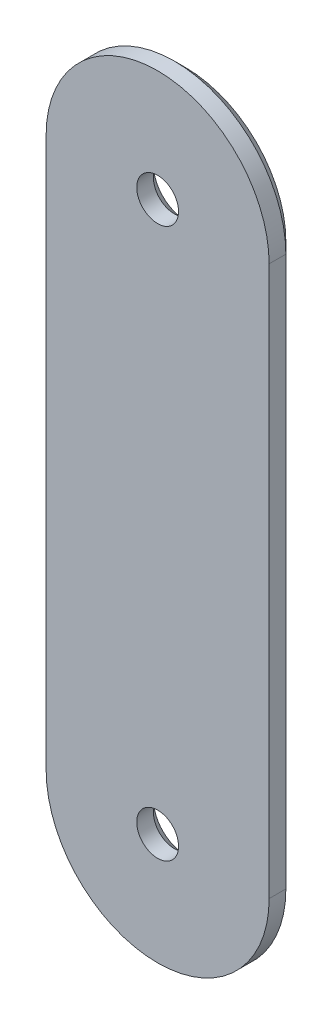
ISO-10303-21;
HEADER;
FILE_DESCRIPTION(('STEP AP214'),'2;1');
FILE_NAME('part.step','',(''),(''),'','','');
FILE_SCHEMA(('AUTOMOTIVE_DESIGN { 1 0 10303 214 1 1 1 1 }'));
ENDSEC;
DATA;
#1=APPLICATION_CONTEXT('core data for automotive mechanical design processes');
#2=APPLICATION_PROTOCOL_DEFINITION('international standard','automotive_design',2000,#1);
#3=PRODUCT_CONTEXT('',#1,'mechanical');
#4=PRODUCT('Part','Part','',(#3));
#5=PRODUCT_RELATED_PRODUCT_CATEGORY('part','',(#4));
#6=PRODUCT_DEFINITION_FORMATION('','',#4);
#7=PRODUCT_DEFINITION_CONTEXT('part definition',#1,'design');
#8=PRODUCT_DEFINITION('design','',#6,#7);
#9=PRODUCT_DEFINITION_SHAPE('','',#8);
#10=(LENGTH_UNIT() NAMED_UNIT(*) SI_UNIT(.MILLI.,.METRE.));
#11=(NAMED_UNIT(*) PLANE_ANGLE_UNIT() SI_UNIT($,.RADIAN.));
#12=(NAMED_UNIT(*) SI_UNIT($,.STERADIAN.) SOLID_ANGLE_UNIT());
#13=UNCERTAINTY_MEASURE_WITH_UNIT(LENGTH_MEASURE(1.E-05),#10,'distance_accuracy_value','');
#14=(GEOMETRIC_REPRESENTATION_CONTEXT(3) GLOBAL_UNCERTAINTY_ASSIGNED_CONTEXT((#13)) GLOBAL_UNIT_ASSIGNED_CONTEXT((#10,
#11,#12)) REPRESENTATION_CONTEXT('',''));
#15=CARTESIAN_POINT('',(0.,0.,0.));
#16=DIRECTION('',(0.,0.,1.));
#17=DIRECTION('',(1.,0.,0.));
#18=AXIS2_PLACEMENT_3D('',#15,#16,#17);
#19=CARTESIAN_POINT('',(-25.4,0.,6.35));
#20=DIRECTION('',(1.,0.,0.));
#21=DIRECTION('',(0.,1.,0.));
#22=AXIS2_PLACEMENT_3D('',#19,#20,#21);
#23=PLANE('',#22);
#24=DIRECTION('',(0.,0.,-1.));
#25=VECTOR('',#24,1.);
#26=CARTESIAN_POINT('',(-25.4,0.,6.35));
#27=LINE('',#26,#25);
#28=CARTESIAN_POINT('',(-25.4,0.,6.35));
#29=VERTEX_POINT('',#28);
#30=CARTESIAN_POINT('',(-25.4,0.,2.54000000000001));
#31=VERTEX_POINT('',#30);
#32=EDGE_CURVE('E201',#29,#31,#27,.T.);
#33=ORIENTED_EDGE('',*,*,#32,.T.);
#34=DIRECTION('',(0.,-1.,0.));
#35=VECTOR('',#34,1.);
#36=CARTESIAN_POINT('',(-25.4,0.,2.54000000000001));
#37=LINE('',#36,#35);
#38=CARTESIAN_POINT('',(-25.4,-125.222,2.54000000000001));
#39=VERTEX_POINT('',#38);
#40=EDGE_CURVE('E130',#31,#39,#37,.T.);
#41=ORIENTED_EDGE('',*,*,#40,.T.);
#42=DIRECTION('',(0.,0.,-1.));
#43=VECTOR('',#42,1.);
#44=CARTESIAN_POINT('',(-25.4,-125.222,6.35));
#45=LINE('',#44,#43);
#46=CARTESIAN_POINT('',(-25.4,-125.222,6.35));
#47=VERTEX_POINT('',#46);
#48=EDGE_CURVE('E111',#47,#39,#45,.T.);
#49=ORIENTED_EDGE('',*,*,#48,.F.);
#50=DIRECTION('',(0.,-1.,0.));
#51=VECTOR('',#50,1.);
#52=CARTESIAN_POINT('',(-25.4,0.,6.35));
#53=LINE('',#52,#51);
#54=EDGE_CURVE('E119',#29,#47,#53,.T.);
#55=ORIENTED_EDGE('',*,*,#54,.F.);
#56=EDGE_LOOP('',(#33,#41,#49,#55));
#57=FACE_BOUND('',#56,.T.);
#58=ADVANCED_FACE('F47',(#57),#23,.F.);
#59=CARTESIAN_POINT('',(0.,-125.222,6.35));
#60=DIRECTION('',(0.,0.,-1.));
#61=DIRECTION('',(-1.,0.,0.));
#62=AXIS2_PLACEMENT_3D('',#59,#60,#61);
#63=CYLINDRICAL_SURFACE('',#62,25.4);
#64=ORIENTED_EDGE('',*,*,#48,.T.);
#65=CARTESIAN_POINT('',(0.,-125.222,2.54000000000001));
#66=DIRECTION('',(0.,0.,1.));
#67=DIRECTION('',(1.,0.,0.));
#68=AXIS2_PLACEMENT_3D('',#65,#66,#67);
#69=CIRCLE('',#68,25.4);
#70=CARTESIAN_POINT('',(25.4,-125.222,2.54000000000001));
#71=VERTEX_POINT('',#70);
#72=EDGE_CURVE('E132',#39,#71,#69,.T.);
#73=ORIENTED_EDGE('',*,*,#72,.T.);
#74=DIRECTION('',(0.,0.,-1.));
#75=VECTOR('',#74,1.);
#76=CARTESIAN_POINT('',(25.4,-125.222,6.35));
#77=LINE('',#76,#75);
#78=CARTESIAN_POINT('',(25.4,-125.222,6.35));
#79=VERTEX_POINT('',#78);
#80=EDGE_CURVE('E113',#79,#71,#77,.T.);
#81=ORIENTED_EDGE('',*,*,#80,.F.);
#82=CARTESIAN_POINT('',(0.,-125.222,6.35));
#83=DIRECTION('',(0.,0.,1.));
#84=DIRECTION('',(1.,0.,0.));
#85=AXIS2_PLACEMENT_3D('',#82,#83,#84);
#86=CIRCLE('',#85,25.4);
#87=EDGE_CURVE('E106',#47,#79,#86,.T.);
#88=ORIENTED_EDGE('',*,*,#87,.F.);
#89=EDGE_LOOP('',(#64,#73,#81,#88));
#90=FACE_BOUND('',#89,.T.);
#91=ADVANCED_FACE('F108',(#90),#63,.T.);
#92=CARTESIAN_POINT('',(25.4,0.,6.35));
#93=DIRECTION('',(1.,0.,0.));
#94=DIRECTION('',(0.,1.,0.));
#95=AXIS2_PLACEMENT_3D('',#92,#93,#94);
#96=PLANE('',#95);
#97=ORIENTED_EDGE('',*,*,#80,.T.);
#98=DIRECTION('',(0.,1.,0.));
#99=VECTOR('',#98,1.);
#100=CARTESIAN_POINT('',(25.4,0.,2.54000000000001));
#101=LINE('',#100,#99);
#102=CARTESIAN_POINT('',(25.4,0.,2.54000000000001));
#103=VERTEX_POINT('',#102);
#104=EDGE_CURVE('E74',#71,#103,#101,.T.);
#105=ORIENTED_EDGE('',*,*,#104,.T.);
#106=DIRECTION('',(0.,0.,-1.));
#107=VECTOR('',#106,1.);
#108=CARTESIAN_POINT('',(25.4,0.,6.35));
#109=LINE('',#108,#107);
#110=CARTESIAN_POINT('',(25.4,0.,6.35));
#111=VERTEX_POINT('',#110);
#112=EDGE_CURVE('E138',#111,#103,#109,.T.);
#113=ORIENTED_EDGE('',*,*,#112,.F.);
#114=DIRECTION('',(0.,-1.,0.));
#115=VECTOR('',#114,1.);
#116=CARTESIAN_POINT('',(25.4,0.,6.35));
#117=LINE('',#116,#115);
#118=EDGE_CURVE('E118',#111,#79,#117,.T.);
#119=ORIENTED_EDGE('',*,*,#118,.T.);
#120=EDGE_LOOP('',(#97,#105,#113,#119));
#121=FACE_BOUND('',#120,.T.);
#122=ADVANCED_FACE('F214',(#121),#96,.T.);
#123=CARTESIAN_POINT('',(0.,0.,6.35));
#124=DIRECTION('',(0.,0.,-1.));
#125=DIRECTION('',(-1.,0.,0.));
#126=AXIS2_PLACEMENT_3D('',#123,#124,#125);
#127=CYLINDRICAL_SURFACE('',#126,25.4);
#128=ORIENTED_EDGE('',*,*,#112,.T.);
#129=CARTESIAN_POINT('',(0.,0.,2.54000000000001));
#130=DIRECTION('',(0.,0.,1.));
#131=DIRECTION('',(1.,0.,0.));
#132=AXIS2_PLACEMENT_3D('',#129,#130,#131);
#133=CIRCLE('',#132,25.4);
#134=EDGE_CURVE('E66',#103,#31,#133,.T.);
#135=ORIENTED_EDGE('',*,*,#134,.T.);
#136=ORIENTED_EDGE('',*,*,#32,.F.);
#137=CARTESIAN_POINT('',(0.,0.,6.35));
#138=DIRECTION('',(0.,0.,1.));
#139=DIRECTION('',(1.,0.,0.));
#140=AXIS2_PLACEMENT_3D('',#137,#138,#139);
#141=CIRCLE('',#140,25.4);
#142=EDGE_CURVE('E124',#111,#29,#141,.T.);
#143=ORIENTED_EDGE('',*,*,#142,.F.);
#144=EDGE_LOOP('',(#128,#135,#136,#143));
#145=FACE_BOUND('',#144,.T.);
#146=ADVANCED_FACE('F204',(#145),#127,.T.);
#147=CARTESIAN_POINT('',(0.,-125.222,6.35));
#148=DIRECTION('',(0.,0.,1.));
#149=DIRECTION('',(1.,0.,0.));
#150=AXIS2_PLACEMENT_3D('',#147,#148,#149);
#151=PLANE('',#150);
#152=CARTESIAN_POINT('',(0.,0.,6.35));
#153=DIRECTION('',(0.,0.,1.));
#154=DIRECTION('',(1.,0.,0.));
#155=AXIS2_PLACEMENT_3D('',#152,#153,#154);
#156=CIRCLE('',#155,4.7625);
#157=CARTESIAN_POINT('',(4.7625,0.,6.35));
#158=VERTEX_POINT('',#157);
#159=EDGE_CURVE('E127',#158,#158,#156,.T.);
#160=ORIENTED_EDGE('',*,*,#159,.F.);
#161=EDGE_LOOP('',(#160));
#162=FACE_BOUND('',#161,.T.);
#163=CARTESIAN_POINT('',(0.,-125.222,6.35));
#164=DIRECTION('',(0.,0.,1.));
#165=DIRECTION('',(1.,0.,0.));
#166=AXIS2_PLACEMENT_3D('',#163,#164,#165);
#167=CIRCLE('',#166,4.7625);
#168=CARTESIAN_POINT('',(4.7625,-125.222,6.35));
#169=VERTEX_POINT('',#168);
#170=EDGE_CURVE('E184',#169,#169,#167,.T.);
#171=ORIENTED_EDGE('',*,*,#170,.F.);
#172=EDGE_LOOP('',(#171));
#173=FACE_BOUND('',#172,.T.);
#174=ORIENTED_EDGE('',*,*,#54,.T.);
#175=ORIENTED_EDGE('',*,*,#87,.T.);
#176=ORIENTED_EDGE('',*,*,#118,.F.);
#177=ORIENTED_EDGE('',*,*,#142,.T.);
#178=EDGE_LOOP('',(#174,#175,#176,#177));
#179=FACE_BOUND('',#178,.T.);
#180=ADVANCED_FACE('F122',(#162,#173,#179),#151,.T.);
#181=CARTESIAN_POINT('',(0.,-125.222,0.));
#182=DIRECTION('',(0.,0.,1.));
#183=DIRECTION('',(1.,0.,0.));
#184=AXIS2_PLACEMENT_3D('',#181,#182,#183);
#185=PLANE('',#184);
#186=DIRECTION('',(0.,-1.,0.));
#187=VECTOR('',#186,1.);
#188=CARTESIAN_POINT('',(22.86,-125.222,0.));
#189=LINE('',#188,#187);
#190=CARTESIAN_POINT('',(22.86,0.,0.));
#191=VERTEX_POINT('',#190);
#192=CARTESIAN_POINT('',(22.86,-125.222,0.));
#193=VERTEX_POINT('',#192);
#194=EDGE_CURVE('E155',#191,#193,#189,.T.);
#195=ORIENTED_EDGE('',*,*,#194,.T.);
#196=CARTESIAN_POINT('',(0.,-125.222,0.));
#197=DIRECTION('',(0.,0.,1.));
#198=DIRECTION('',(1.,0.,0.));
#199=AXIS2_PLACEMENT_3D('',#196,#197,#198);
#200=CIRCLE('',#199,22.86);
#201=CARTESIAN_POINT('',(-22.86,-125.222,0.));
#202=VERTEX_POINT('',#201);
#203=EDGE_CURVE('E158',#193,#202,#200,.F.);
#204=ORIENTED_EDGE('',*,*,#203,.T.);
#205=DIRECTION('',(0.,1.,0.));
#206=VECTOR('',#205,1.);
#207=CARTESIAN_POINT('',(-22.86,-125.222,0.));
#208=LINE('',#207,#206);
#209=CARTESIAN_POINT('',(-22.86,0.,0.));
#210=VERTEX_POINT('',#209);
#211=EDGE_CURVE('E149',#202,#210,#208,.T.);
#212=ORIENTED_EDGE('',*,*,#211,.T.);
#213=CARTESIAN_POINT('',(0.,0.,0.));
#214=DIRECTION('',(0.,0.,1.));
#215=DIRECTION('',(1.,0.,0.));
#216=AXIS2_PLACEMENT_3D('',#213,#214,#215);
#217=CIRCLE('',#216,22.86);
#218=EDGE_CURVE('E152',#210,#191,#217,.F.);
#219=ORIENTED_EDGE('',*,*,#218,.T.);
#220=EDGE_LOOP('',(#195,#204,#212,#219));
#221=FACE_BOUND('',#220,.T.);
#222=CARTESIAN_POINT('',(0.,-125.222,0.));
#223=DIRECTION('',(0.,0.,1.));
#224=DIRECTION('',(1.,0.,0.));
#225=AXIS2_PLACEMENT_3D('',#222,#223,#224);
#226=CIRCLE('',#225,7.30249999999999);
#227=CARTESIAN_POINT('',(7.30249999999999,-125.222,0.));
#228=VERTEX_POINT('',#227);
#229=EDGE_CURVE('E145',#228,#228,#226,.T.);
#230=ORIENTED_EDGE('',*,*,#229,.T.);
#231=EDGE_LOOP('',(#230));
#232=FACE_BOUND('',#231,.T.);
#233=CARTESIAN_POINT('',(0.,0.,0.));
#234=DIRECTION('',(0.,0.,1.));
#235=DIRECTION('',(1.,0.,0.));
#236=AXIS2_PLACEMENT_3D('',#233,#234,#235);
#237=CIRCLE('',#236,7.30249999999995);
#238=CARTESIAN_POINT('',(7.30249999999995,0.,0.));
#239=VERTEX_POINT('',#238);
#240=EDGE_CURVE('E136',#239,#239,#237,.T.);
#241=ORIENTED_EDGE('',*,*,#240,.T.);
#242=EDGE_LOOP('',(#241));
#243=FACE_BOUND('',#242,.T.);
#244=ADVANCED_FACE('F264',(#221,#232,#243),#185,.F.);
#245=CARTESIAN_POINT('',(0.,-125.222,0.));
#246=DIRECTION('',(0.,0.,1.));
#247=DIRECTION('',(1.,0.,0.));
#248=AXIS2_PLACEMENT_3D('',#245,#246,#247);
#249=CYLINDRICAL_SURFACE('',#248,4.7625);
#250=CARTESIAN_POINT('',(0.,-125.222,2.54000000000002));
#251=DIRECTION('',(0.,0.,1.));
#252=DIRECTION('',(1.,0.,0.));
#253=AXIS2_PLACEMENT_3D('',#250,#251,#252);
#254=CIRCLE('',#253,4.7625);
#255=CARTESIAN_POINT('',(4.7625,-125.222,2.54000000000002));
#256=VERTEX_POINT('',#255);
#257=EDGE_CURVE('E58',#256,#256,#254,.F.);
#258=ORIENTED_EDGE('',*,*,#257,.T.);
#259=EDGE_LOOP('',(#258));
#260=FACE_BOUND('',#259,.T.);
#261=ORIENTED_EDGE('',*,*,#170,.T.);
#262=EDGE_LOOP('',(#261));
#263=FACE_BOUND('',#262,.T.);
#264=ADVANCED_FACE('F267',(#260,#263),#249,.F.);
#265=CARTESIAN_POINT('',(0.,0.,0.));
#266=DIRECTION('',(0.,0.,1.));
#267=DIRECTION('',(1.,0.,0.));
#268=AXIS2_PLACEMENT_3D('',#265,#266,#267);
#269=CYLINDRICAL_SURFACE('',#268,4.7625);
#270=CARTESIAN_POINT('',(0.,0.,2.53999999999997));
#271=DIRECTION('',(0.,0.,1.));
#272=DIRECTION('',(1.,0.,0.));
#273=AXIS2_PLACEMENT_3D('',#270,#271,#272);
#274=CIRCLE('',#273,4.7625);
#275=CARTESIAN_POINT('',(4.7625,0.,2.53999999999997));
#276=VERTEX_POINT('',#275);
#277=EDGE_CURVE('E11',#276,#276,#274,.F.);
#278=ORIENTED_EDGE('',*,*,#277,.T.);
#279=EDGE_LOOP('',(#278));
#280=FACE_BOUND('',#279,.T.);
#281=ORIENTED_EDGE('',*,*,#159,.T.);
#282=EDGE_LOOP('',(#281));
#283=FACE_BOUND('',#282,.T.);
#284=ADVANCED_FACE('F251',(#280,#283),#269,.F.);
#285=CARTESIAN_POINT('',(0.,0.,2.54000000000001));
#286=DIRECTION('',(0.,0.,1.));
#287=DIRECTION('',(1.,0.,0.));
#288=AXIS2_PLACEMENT_3D('',#285,#286,#287);
#289=CONICAL_SURFACE('',#288,25.4,0.785398163397448);
#290=DIRECTION('',(0.707106781186547,0.,0.707106781186547));
#291=VECTOR('',#290,1.);
#292=CARTESIAN_POINT('',(22.86,0.,0.));
#293=LINE('',#292,#291);
#294=EDGE_CURVE('E176',#191,#103,#293,.T.);
#295=ORIENTED_EDGE('',*,*,#294,.F.);
#296=ORIENTED_EDGE('',*,*,#218,.F.);
#297=DIRECTION('',(0.707106781186547,0.,-0.707106781186547));
#298=VECTOR('',#297,1.);
#299=CARTESIAN_POINT('',(-25.4,0.,2.54000000000001));
#300=LINE('',#299,#298);
#301=EDGE_CURVE('E52',#31,#210,#300,.T.);
#302=ORIENTED_EDGE('',*,*,#301,.F.);
#303=ORIENTED_EDGE('',*,*,#134,.F.);
#304=EDGE_LOOP('',(#295,#296,#302,#303));
#305=FACE_BOUND('',#304,.T.);
#306=ADVANCED_FACE('F206',(#305),#289,.T.);
#307=CARTESIAN_POINT('',(-25.4,0.,2.54000000000001));
#308=DIRECTION('',(0.707106781186547,0.,0.707106781186547));
#309=DIRECTION('',(0.,-1.,0.));
#310=AXIS2_PLACEMENT_3D('',#307,#308,#309);
#311=PLANE('',#310);
#312=ORIENTED_EDGE('',*,*,#301,.T.);
#313=ORIENTED_EDGE('',*,*,#211,.F.);
#314=DIRECTION('',(0.707106781186547,0.,-0.707106781186547));
#315=VECTOR('',#314,1.);
#316=CARTESIAN_POINT('',(-25.4,-125.222,2.54000000000001));
#317=LINE('',#316,#315);
#318=EDGE_CURVE('E174',#39,#202,#317,.T.);
#319=ORIENTED_EDGE('',*,*,#318,.F.);
#320=ORIENTED_EDGE('',*,*,#40,.F.);
#321=EDGE_LOOP('',(#312,#313,#319,#320));
#322=FACE_BOUND('',#321,.T.);
#323=ADVANCED_FACE('F208',(#322),#311,.F.);
#324=CARTESIAN_POINT('',(22.86,-125.222,0.));
#325=DIRECTION('',(0.707106781186547,0.,-0.707106781186547));
#326=DIRECTION('',(0.,1.,0.));
#327=AXIS2_PLACEMENT_3D('',#324,#325,#326);
#328=PLANE('',#327);
#329=ORIENTED_EDGE('',*,*,#294,.T.);
#330=ORIENTED_EDGE('',*,*,#104,.F.);
#331=DIRECTION('',(0.707106781186547,0.,0.707106781186547));
#332=VECTOR('',#331,1.);
#333=CARTESIAN_POINT('',(22.86,-125.222,0.));
#334=LINE('',#333,#332);
#335=EDGE_CURVE('E171',#193,#71,#334,.T.);
#336=ORIENTED_EDGE('',*,*,#335,.F.);
#337=ORIENTED_EDGE('',*,*,#194,.F.);
#338=EDGE_LOOP('',(#329,#330,#336,#337));
#339=FACE_BOUND('',#338,.T.);
#340=ADVANCED_FACE('F237',(#339),#328,.T.);
#341=CARTESIAN_POINT('',(0.,-125.222,2.54000000000001));
#342=DIRECTION('',(0.,0.,1.));
#343=DIRECTION('',(1.,0.,0.));
#344=AXIS2_PLACEMENT_3D('',#341,#342,#343);
#345=CONICAL_SURFACE('',#344,25.4,0.785398163397448);
#346=ORIENTED_EDGE('',*,*,#318,.T.);
#347=ORIENTED_EDGE('',*,*,#203,.F.);
#348=ORIENTED_EDGE('',*,*,#335,.T.);
#349=ORIENTED_EDGE('',*,*,#72,.F.);
#350=EDGE_LOOP('',(#346,#347,#348,#349));
#351=FACE_BOUND('',#350,.T.);
#352=ADVANCED_FACE('F212',(#351),#345,.T.);
#353=CARTESIAN_POINT('',(0.,-125.222,0.));
#354=DIRECTION('',(0.,0.,-1.));
#355=DIRECTION('',(-1.,0.,0.));
#356=AXIS2_PLACEMENT_3D('',#353,#354,#355);
#357=CONICAL_SURFACE('',#356,7.30249999999999,0.785398163397443);
#358=ORIENTED_EDGE('',*,*,#257,.F.);
#359=EDGE_LOOP('',(#358));
#360=FACE_BOUND('',#359,.T.);
#361=ORIENTED_EDGE('',*,*,#229,.F.);
#362=EDGE_LOOP('',(#361));
#363=FACE_BOUND('',#362,.T.);
#364=ADVANCED_FACE('F236',(#360,#363),#357,.F.);
#365=CARTESIAN_POINT('',(0.,0.,0.));
#366=DIRECTION('',(0.,0.,-1.));
#367=DIRECTION('',(-1.,0.,0.));
#368=AXIS2_PLACEMENT_3D('',#365,#366,#367);
#369=CONICAL_SURFACE('',#368,7.30249999999995,0.785398163397444);
#370=ORIENTED_EDGE('',*,*,#277,.F.);
#371=EDGE_LOOP('',(#370));
#372=FACE_BOUND('',#371,.T.);
#373=ORIENTED_EDGE('',*,*,#240,.F.);
#374=EDGE_LOOP('',(#373));
#375=FACE_BOUND('',#374,.T.);
#376=ADVANCED_FACE('F50',(#372,#375),#369,.F.);
#377=CLOSED_SHELL('',(#58,#91,#122,#146,#180,#244,#264,#284,#306,#323,#340,#352,#364,#376));
#378=MANIFOLD_SOLID_BREP('B2',#377);
#379=ADVANCED_BREP_SHAPE_REPRESENTATION('',(#18,#378),#14);
#380=SHAPE_DEFINITION_REPRESENTATION(#9,#379);
ENDSEC;
END-ISO-10303-21;
